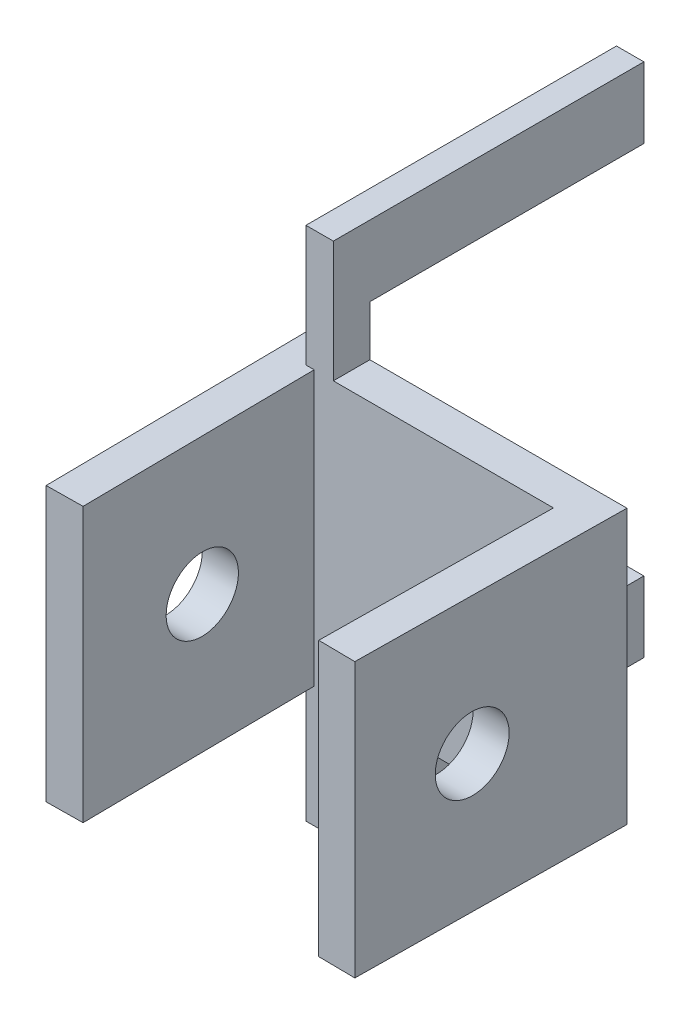
ISO-10303-21;
HEADER;
FILE_DESCRIPTION(('STEP AP214'),'2;1');
FILE_NAME('part.step','',(''),(''),'','','');
FILE_SCHEMA(('AUTOMOTIVE_DESIGN { 1 0 10303 214 1 1 1 1 }'));
ENDSEC;
DATA;
#1=APPLICATION_CONTEXT('core data for automotive mechanical design processes');
#2=APPLICATION_PROTOCOL_DEFINITION('international standard','automotive_design',2000,#1);
#3=PRODUCT_CONTEXT('',#1,'mechanical');
#4=PRODUCT('Part','Part','',(#3));
#5=PRODUCT_RELATED_PRODUCT_CATEGORY('part','',(#4));
#6=PRODUCT_DEFINITION_FORMATION('','',#4);
#7=PRODUCT_DEFINITION_CONTEXT('part definition',#1,'design');
#8=PRODUCT_DEFINITION('design','',#6,#7);
#9=PRODUCT_DEFINITION_SHAPE('','',#8);
#10=(LENGTH_UNIT() NAMED_UNIT(*) SI_UNIT(.MILLI.,.METRE.));
#11=(NAMED_UNIT(*) PLANE_ANGLE_UNIT() SI_UNIT($,.RADIAN.));
#12=(NAMED_UNIT(*) SI_UNIT($,.STERADIAN.) SOLID_ANGLE_UNIT());
#13=UNCERTAINTY_MEASURE_WITH_UNIT(LENGTH_MEASURE(1.E-05),#10,'distance_accuracy_value','');
#14=(GEOMETRIC_REPRESENTATION_CONTEXT(3) GLOBAL_UNCERTAINTY_ASSIGNED_CONTEXT((#13)) GLOBAL_UNIT_ASSIGNED_CONTEXT((#10,
#11,#12)) REPRESENTATION_CONTEXT('',''));
#15=CARTESIAN_POINT('',(0.,0.,0.));
#16=DIRECTION('',(0.,0.,1.));
#17=DIRECTION('',(1.,0.,0.));
#18=AXIS2_PLACEMENT_3D('',#15,#16,#17);
#19=CARTESIAN_POINT('',(0.,30.,0.));
#20=DIRECTION('',(0.,1.,0.));
#21=DIRECTION('',(0.,0.,1.));
#22=AXIS2_PLACEMENT_3D('',#19,#20,#21);
#23=PLANE('',#22);
#24=DIRECTION('',(0.,0.,-1.));
#25=VECTOR('',#24,1.);
#26=CARTESIAN_POINT('',(-10.9998132817287,30.,0.));
#27=LINE('',#26,#25);
#28=CARTESIAN_POINT('',(-10.9998132817287,30.,-12.8));
#29=VERTEX_POINT('',#28);
#30=CARTESIAN_POINT('',(-10.9998132817287,30.,-16.8));
#31=VERTEX_POINT('',#30);
#32=EDGE_CURVE('E252',#29,#31,#27,.T.);
#33=ORIENTED_EDGE('',*,*,#32,.F.);
#34=DIRECTION('',(1.,0.,0.));
#35=VECTOR('',#34,1.);
#36=CARTESIAN_POINT('',(-13.1,30.,-12.8));
#37=LINE('',#36,#35);
#38=CARTESIAN_POINT('',(13.1,30.,-12.8));
#39=VERTEX_POINT('',#38);
#40=EDGE_CURVE('E271',#29,#39,#37,.T.);
#41=ORIENTED_EDGE('',*,*,#40,.T.);
#42=DIRECTION('',(-0.0118101998876842,0.,0.999930257157274));
#43=VECTOR('',#42,1.);
#44=CARTESIAN_POINT('',(13.1,30.,-12.8));
#45=LINE('',#44,#43);
#46=CARTESIAN_POINT('',(12.8,30.,12.6));
#47=VERTEX_POINT('',#46);
#48=EDGE_CURVE('E273',#39,#47,#45,.T.);
#49=ORIENTED_EDGE('',*,*,#48,.T.);
#50=DIRECTION('',(0.999930257157274,0.,0.0118101998876842));
#51=VECTOR('',#50,1.);
#52=CARTESIAN_POINT('',(12.8,30.,12.6));
#53=LINE('',#52,#51);
#54=CARTESIAN_POINT('',(16.7997210286291,30.,12.6472407995507));
#55=VERTEX_POINT('',#54);
#56=EDGE_CURVE('E275',#47,#55,#53,.T.);
#57=ORIENTED_EDGE('',*,*,#56,.T.);
#58=DIRECTION('',(0.0118101998876842,0.,-0.999930257157274));
#59=VECTOR('',#58,1.);
#60=CARTESIAN_POINT('',(17.1475230853167,30.,-16.8));
#61=LINE('',#60,#59);
#62=CARTESIAN_POINT('',(17.1475230853167,30.,-16.8));
#63=VERTEX_POINT('',#62);
#64=EDGE_CURVE('E277',#55,#63,#61,.T.);
#65=ORIENTED_EDGE('',*,*,#64,.T.);
#66=DIRECTION('',(-1.,0.,0.));
#67=VECTOR('',#66,1.);
#68=CARTESIAN_POINT('',(-17.1471496487741,30.,-16.8));
#69=LINE('',#68,#67);
#70=EDGE_CURVE('E56',#63,#31,#69,.T.);
#71=ORIENTED_EDGE('',*,*,#70,.T.);
#72=EDGE_LOOP('',(#33,#41,#49,#57,#65,#71));
#73=FACE_BOUND('',#72,.T.);
#74=ADVANCED_FACE('F33',(#73),#23,.T.);
#75=CARTESIAN_POINT('',(0.,0.,0.));
#76=DIRECTION('',(0.,1.,0.));
#77=DIRECTION('',(0.,0.,1.));
#78=AXIS2_PLACEMENT_3D('',#75,#76,#77);
#79=PLANE('',#78);
#80=DIRECTION('',(1.,0.,0.));
#81=VECTOR('',#80,1.);
#82=CARTESIAN_POINT('',(-13.1,0.,-12.8));
#83=LINE('',#82,#81);
#84=CARTESIAN_POINT('',(-10.9998132817287,0.,-12.8));
#85=VERTEX_POINT('',#84);
#86=CARTESIAN_POINT('',(13.1,0.,-12.8));
#87=VERTEX_POINT('',#86);
#88=EDGE_CURVE('E289',#85,#87,#83,.T.);
#89=ORIENTED_EDGE('',*,*,#88,.F.);
#90=DIRECTION('',(0.,0.,-1.));
#91=VECTOR('',#90,1.);
#92=CARTESIAN_POINT('',(-10.9998132817287,0.,0.));
#93=LINE('',#92,#91);
#94=CARTESIAN_POINT('',(-10.9998132817287,0.,-16.8));
#95=VERTEX_POINT('',#94);
#96=EDGE_CURVE('E11',#85,#95,#93,.T.);
#97=ORIENTED_EDGE('',*,*,#96,.T.);
#98=DIRECTION('',(-1.,0.,0.));
#99=VECTOR('',#98,1.);
#100=CARTESIAN_POINT('',(-17.1471496487741,0.,-16.8));
#101=LINE('',#100,#99);
#102=CARTESIAN_POINT('',(17.1475230853167,0.,-16.8));
#103=VERTEX_POINT('',#102);
#104=EDGE_CURVE('E298',#103,#95,#101,.T.);
#105=ORIENTED_EDGE('',*,*,#104,.F.);
#106=DIRECTION('',(0.0118101998876842,0.,-0.999930257157274));
#107=VECTOR('',#106,1.);
#108=CARTESIAN_POINT('',(17.1475230853167,0.,-16.8));
#109=LINE('',#108,#107);
#110=CARTESIAN_POINT('',(16.7997210286291,0.,12.6472407995507));
#111=VERTEX_POINT('',#110);
#112=EDGE_CURVE('E295',#111,#103,#109,.T.);
#113=ORIENTED_EDGE('',*,*,#112,.F.);
#114=DIRECTION('',(0.999930257157274,0.,0.0118101998876842));
#115=VECTOR('',#114,1.);
#116=CARTESIAN_POINT('',(12.8,0.,12.6));
#117=LINE('',#116,#115);
#118=CARTESIAN_POINT('',(12.8,0.,12.6));
#119=VERTEX_POINT('',#118);
#120=EDGE_CURVE('E293',#119,#111,#117,.T.);
#121=ORIENTED_EDGE('',*,*,#120,.F.);
#122=DIRECTION('',(-0.0118101998876842,0.,0.999930257157274));
#123=VECTOR('',#122,1.);
#124=CARTESIAN_POINT('',(13.1,0.,-12.8));
#125=LINE('',#124,#123);
#126=EDGE_CURVE('E291',#87,#119,#125,.T.);
#127=ORIENTED_EDGE('',*,*,#126,.F.);
#128=EDGE_LOOP('',(#89,#97,#105,#113,#121,#127));
#129=FACE_BOUND('',#128,.T.);
#130=ADVANCED_FACE('F351',(#129),#79,.F.);
#131=CARTESIAN_POINT('',(-16.7997253700826,30.,12.8468717816807));
#132=DIRECTION('',(-0.0117179454201641,0.,-0.99993134252064));
#133=DIRECTION('',(-0.99993134252064,0.,0.0117179454201641));
#134=AXIS2_PLACEMENT_3D('',#131,#132,#133);
#135=PLANE('',#134);
#136=DIRECTION('',(0.999931342520641,0.,-0.0117179454201641));
#137=VECTOR('',#136,1.);
#138=CARTESIAN_POINT('',(-16.7997253700826,0.,12.8468717816807));
#139=LINE('',#138,#137);
#140=CARTESIAN_POINT('',(-16.7997253700826,0.,12.8468717816807));
#141=VERTEX_POINT('',#140);
#142=CARTESIAN_POINT('',(-12.8,0.,12.8));
#143=VERTEX_POINT('',#142);
#144=EDGE_CURVE('E264',#141,#143,#139,.T.);
#145=ORIENTED_EDGE('',*,*,#144,.T.);
#146=DIRECTION('',(0.,-1.,0.));
#147=VECTOR('',#146,1.);
#148=CARTESIAN_POINT('',(-12.8,30.,12.8));
#149=LINE('',#148,#147);
#150=CARTESIAN_POINT('',(-12.8,30.,12.8));
#151=VERTEX_POINT('',#150);
#152=EDGE_CURVE('E322',#151,#143,#149,.T.);
#153=ORIENTED_EDGE('',*,*,#152,.F.);
#154=DIRECTION('',(0.999931342520641,0.,-0.0117179454201641));
#155=VECTOR('',#154,1.);
#156=CARTESIAN_POINT('',(-16.7997253700826,30.,12.8468717816807));
#157=LINE('',#156,#155);
#158=CARTESIAN_POINT('',(-16.7997253700826,30.,12.8468717816807));
#159=VERTEX_POINT('',#158);
#160=EDGE_CURVE('E265',#159,#151,#157,.T.);
#161=ORIENTED_EDGE('',*,*,#160,.F.);
#162=DIRECTION('',(0.,-1.,0.));
#163=VECTOR('',#162,1.);
#164=CARTESIAN_POINT('',(-16.7997253700826,30.,12.8468717816807));
#165=LINE('',#164,#163);
#166=EDGE_CURVE('E283',#159,#141,#165,.T.);
#167=ORIENTED_EDGE('',*,*,#166,.T.);
#168=EDGE_LOOP('',(#145,#153,#161,#167));
#169=FACE_BOUND('',#168,.T.);
#170=ADVANCED_FACE('F35',(#169),#135,.F.);
#171=CARTESIAN_POINT('',(-12.8,30.,12.8));
#172=DIRECTION('',(-0.99993134252064,0.,0.0117179454201639));
#173=DIRECTION('',(0.0117179454201639,0.,0.99993134252064));
#174=AXIS2_PLACEMENT_3D('',#171,#172,#173);
#175=PLANE('',#174);
#176=CARTESIAN_POINT('',(-12.9547469811038,15.,-0.4050757208542));
#177=DIRECTION('',(-0.99993134252064,0.,0.0117179454201639));
#178=DIRECTION('',(0.0117179454201639,0.,0.99993134252064));
#179=AXIS2_PLACEMENT_3D('',#176,#177,#178);
#180=ELLIPSE('',#179,4.00110745377421,4.);
#181=CARTESIAN_POINT('',(-12.9078622223402,15.,3.59575702696759));
#182=VERTEX_POINT('',#181);
#183=EDGE_CURVE('E261',#182,#182,#180,.T.);
#184=ORIENTED_EDGE('',*,*,#183,.T.);
#185=EDGE_LOOP('',(#184));
#186=FACE_BOUND('',#185,.T.);
#187=DIRECTION('',(-0.0117179454201639,0.,-0.99993134252064));
#188=VECTOR('',#187,1.);
#189=CARTESIAN_POINT('',(-12.8,0.,12.8));
#190=LINE('',#189,#188);
#191=CARTESIAN_POINT('',(-13.1,0.,-12.8));
#192=VERTEX_POINT('',#191);
#193=EDGE_CURVE('E286',#143,#192,#190,.T.);
#194=ORIENTED_EDGE('',*,*,#193,.T.);
#195=DIRECTION('',(0.,-1.,0.));
#196=VECTOR('',#195,1.);
#197=CARTESIAN_POINT('',(-13.1,30.,-12.8));
#198=LINE('',#197,#196);
#199=CARTESIAN_POINT('',(-13.1,30.,-12.8));
#200=VERTEX_POINT('',#199);
#201=EDGE_CURVE('E319',#200,#192,#198,.T.);
#202=ORIENTED_EDGE('',*,*,#201,.F.);
#203=DIRECTION('',(-0.0117179454201639,0.,-0.99993134252064));
#204=VECTOR('',#203,1.);
#205=CARTESIAN_POINT('',(-12.8,30.,12.8));
#206=LINE('',#205,#204);
#207=EDGE_CURVE('E268',#151,#200,#206,.T.);
#208=ORIENTED_EDGE('',*,*,#207,.F.);
#209=ORIENTED_EDGE('',*,*,#152,.T.);
#210=EDGE_LOOP('',(#194,#202,#208,#209));
#211=FACE_BOUND('',#210,.T.);
#212=ADVANCED_FACE('F389',(#186,#211),#175,.F.);
#213=CARTESIAN_POINT('',(-13.1,30.,-12.8));
#214=DIRECTION('',(0.,0.,-1.));
#215=DIRECTION('',(-1.,0.,0.));
#216=AXIS2_PLACEMENT_3D('',#213,#214,#215);
#217=PLANE('',#216);
#218=ORIENTED_EDGE('',*,*,#40,.F.);
#219=DIRECTION('',(0.,-1.,0.));
#220=VECTOR('',#219,1.);
#221=CARTESIAN_POINT('',(-10.9998132817287,-5.5,-12.8));
#222=LINE('',#221,#220);
#223=CARTESIAN_POINT('',(-10.9998132817287,43.25,-12.8));
#224=VERTEX_POINT('',#223);
#225=EDGE_CURVE('E179',#224,#29,#222,.T.);
#226=ORIENTED_EDGE('',*,*,#225,.F.);
#227=DIRECTION('',(1.,0.,0.));
#228=VECTOR('',#227,1.);
#229=CARTESIAN_POINT('',(-10.9998132817287,43.25,-12.8));
#230=LINE('',#229,#228);
#231=CARTESIAN_POINT('',(-13.9998132817287,43.25,-12.8));
#232=VERTEX_POINT('',#231);
#233=EDGE_CURVE('E189',#232,#224,#230,.T.);
#234=ORIENTED_EDGE('',*,*,#233,.F.);
#235=DIRECTION('',(0.,1.,0.));
#236=VECTOR('',#235,1.);
#237=CARTESIAN_POINT('',(-13.9998132817287,35.5,-12.8));
#238=LINE('',#237,#236);
#239=CARTESIAN_POINT('',(-13.9998132817287,30.,-12.8));
#240=VERTEX_POINT('',#239);
#241=EDGE_CURVE('E234',#240,#232,#238,.T.);
#242=ORIENTED_EDGE('',*,*,#241,.F.);
#243=DIRECTION('',(1.,0.,0.));
#244=VECTOR('',#243,1.);
#245=CARTESIAN_POINT('',(0.,30.,-12.8));
#246=LINE('',#245,#244);
#247=EDGE_CURVE('E48',#240,#200,#246,.T.);
#248=ORIENTED_EDGE('',*,*,#247,.T.);
#249=ORIENTED_EDGE('',*,*,#201,.T.);
#250=DIRECTION('',(1.,0.,0.));
#251=VECTOR('',#250,1.);
#252=CARTESIAN_POINT('',(0.,0.,-12.8));
#253=LINE('',#252,#251);
#254=CARTESIAN_POINT('',(-13.9998132817287,0.,-12.8));
#255=VERTEX_POINT('',#254);
#256=EDGE_CURVE('E325',#255,#192,#253,.T.);
#257=ORIENTED_EDGE('',*,*,#256,.F.);
#258=CARTESIAN_POINT('',(-13.9998132817287,-13.25,-12.8));
#259=VERTEX_POINT('',#258);
#260=EDGE_CURVE('E180',#259,#255,#238,.T.);
#261=ORIENTED_EDGE('',*,*,#260,.F.);
#262=DIRECTION('',(-1.,0.,0.));
#263=VECTOR('',#262,1.);
#264=CARTESIAN_POINT('',(-10.9998132817287,-13.25,-12.8));
#265=LINE('',#264,#263);
#266=CARTESIAN_POINT('',(-10.9998132817287,-13.25,-12.8));
#267=VERTEX_POINT('',#266);
#268=EDGE_CURVE('E186',#267,#259,#265,.T.);
#269=ORIENTED_EDGE('',*,*,#268,.F.);
#270=EDGE_CURVE('E171',#85,#267,#222,.T.);
#271=ORIENTED_EDGE('',*,*,#270,.F.);
#272=ORIENTED_EDGE('',*,*,#88,.T.);
#273=DIRECTION('',(0.,-1.,0.));
#274=VECTOR('',#273,1.);
#275=CARTESIAN_POINT('',(13.1,30.,-12.8));
#276=LINE('',#275,#274);
#277=EDGE_CURVE('E316',#39,#87,#276,.T.);
#278=ORIENTED_EDGE('',*,*,#277,.F.);
#279=EDGE_LOOP('',(#218,#226,#234,#242,#248,#249,#257,#261,#269,#271,#272,#278));
#280=FACE_BOUND('',#279,.T.);
#281=ADVANCED_FACE('F193',(#280),#217,.F.);
#282=CARTESIAN_POINT('',(13.1,30.,-12.8));
#283=DIRECTION('',(0.999930257157274,0.,0.0118101998876842));
#284=DIRECTION('',(0.0118101998876842,0.,-0.999930257157275));
#285=AXIS2_PLACEMENT_3D('',#282,#283,#284);
#286=PLANE('',#285);
#287=CARTESIAN_POINT('',(12.9499895385736,15.,-0.0991142658973837));
#288=DIRECTION('',(0.999930257157274,0.,0.0118101998876842));
#289=DIRECTION('',(0.0118101998876842,0.,-0.999930257157275));
#290=AXIS2_PLACEMENT_3D('',#287,#288,#289);
#291=CIRCLE('',#290,4.);
#292=CARTESIAN_POINT('',(12.9972303381243,15.,-4.09883529452648));
#293=VERTEX_POINT('',#292);
#294=EDGE_CURVE('E258',#293,#293,#291,.T.);
#295=ORIENTED_EDGE('',*,*,#294,.T.);
#296=EDGE_LOOP('',(#295));
#297=FACE_BOUND('',#296,.T.);
#298=ORIENTED_EDGE('',*,*,#126,.T.);
#299=DIRECTION('',(0.,-1.,0.));
#300=VECTOR('',#299,1.);
#301=CARTESIAN_POINT('',(12.8,30.,12.6));
#302=LINE('',#301,#300);
#303=EDGE_CURVE('E313',#47,#119,#302,.T.);
#304=ORIENTED_EDGE('',*,*,#303,.F.);
#305=ORIENTED_EDGE('',*,*,#48,.F.);
#306=ORIENTED_EDGE('',*,*,#277,.T.);
#307=EDGE_LOOP('',(#298,#304,#305,#306));
#308=FACE_BOUND('',#307,.T.);
#309=ADVANCED_FACE('F357',(#297,#308),#286,.F.);
#310=CARTESIAN_POINT('',(12.8,30.,12.6));
#311=DIRECTION('',(0.0118101998876842,0.,-0.999930257157274));
#312=DIRECTION('',(-0.999930257157275,0.,-0.0118101998876842));
#313=AXIS2_PLACEMENT_3D('',#310,#311,#312);
#314=PLANE('',#313);
#315=ORIENTED_EDGE('',*,*,#120,.T.);
#316=DIRECTION('',(0.,-1.,0.));
#317=VECTOR('',#316,1.);
#318=CARTESIAN_POINT('',(16.7997210286291,30.,12.6472407995507));
#319=LINE('',#318,#317);
#320=EDGE_CURVE('E310',#55,#111,#319,.T.);
#321=ORIENTED_EDGE('',*,*,#320,.F.);
#322=ORIENTED_EDGE('',*,*,#56,.F.);
#323=ORIENTED_EDGE('',*,*,#303,.T.);
#324=EDGE_LOOP('',(#315,#321,#322,#323));
#325=FACE_BOUND('',#324,.T.);
#326=ADVANCED_FACE('F420',(#325),#314,.F.);
#327=CARTESIAN_POINT('',(17.1475230853167,30.,-16.8));
#328=DIRECTION('',(-0.999930257157274,0.,-0.0118101998876842));
#329=DIRECTION('',(-0.0118101998876842,0.,0.999930257157275));
#330=AXIS2_PLACEMENT_3D('',#327,#328,#329);
#331=PLANE('',#330);
#332=CARTESIAN_POINT('',(16.9497105672027,15.,-0.0518734663466469));
#333=DIRECTION('',(0.999930257157274,0.,0.0118101998876842));
#334=DIRECTION('',(0.0118101998876842,0.,-0.999930257157274));
#335=AXIS2_PLACEMENT_3D('',#332,#333,#334);
#336=CIRCLE('',#335,4.);
#337=CARTESIAN_POINT('',(16.9969513667534,15.,-4.05159449497575));
#338=VERTEX_POINT('',#337);
#339=EDGE_CURVE('E254',#338,#338,#336,.T.);
#340=ORIENTED_EDGE('',*,*,#339,.F.);
#341=EDGE_LOOP('',(#340));
#342=FACE_BOUND('',#341,.T.);
#343=ORIENTED_EDGE('',*,*,#112,.T.);
#344=DIRECTION('',(0.,-1.,0.));
#345=VECTOR('',#344,1.);
#346=CARTESIAN_POINT('',(17.1475230853167,30.,-16.8));
#347=LINE('',#346,#345);
#348=EDGE_CURVE('E307',#63,#103,#347,.T.);
#349=ORIENTED_EDGE('',*,*,#348,.F.);
#350=ORIENTED_EDGE('',*,*,#64,.F.);
#351=ORIENTED_EDGE('',*,*,#320,.T.);
#352=EDGE_LOOP('',(#343,#349,#350,#351));
#353=FACE_BOUND('',#352,.T.);
#354=ADVANCED_FACE('F415',(#342,#353),#331,.F.);
#355=CARTESIAN_POINT('',(-17.1471496487741,30.,-16.8));
#356=DIRECTION('',(0.,0.,1.));
#357=DIRECTION('',(1.,0.,0.));
#358=AXIS2_PLACEMENT_3D('',#355,#356,#357);
#359=PLANE('',#358);
#360=CARTESIAN_POINT('',(-13.9998132817287,30.,-16.8));
#361=VERTEX_POINT('',#360);
#362=CARTESIAN_POINT('',(-17.1471496487741,30.,-16.8));
#363=VERTEX_POINT('',#362);
#364=EDGE_CURVE('E279',#361,#363,#69,.T.);
#365=ORIENTED_EDGE('',*,*,#364,.F.);
#366=DIRECTION('',(0.,1.,0.));
#367=VECTOR('',#366,1.);
#368=CARTESIAN_POINT('',(-13.9998132817287,35.5,-16.8));
#369=LINE('',#368,#367);
#370=CARTESIAN_POINT('',(-13.9998132817287,35.5,-16.8));
#371=VERTEX_POINT('',#370);
#372=EDGE_CURVE('E239',#361,#371,#369,.T.);
#373=ORIENTED_EDGE('',*,*,#372,.T.);
#374=DIRECTION('',(1.,0.,0.));
#375=VECTOR('',#374,1.);
#376=CARTESIAN_POINT('',(-10.9998132817287,35.5,-16.8));
#377=LINE('',#376,#375);
#378=CARTESIAN_POINT('',(-10.9998132817287,35.5,-16.8));
#379=VERTEX_POINT('',#378);
#380=EDGE_CURVE('E242',#371,#379,#377,.T.);
#381=ORIENTED_EDGE('',*,*,#380,.T.);
#382=DIRECTION('',(0.,-1.,0.));
#383=VECTOR('',#382,1.);
#384=CARTESIAN_POINT('',(-10.9998132817287,-5.5,-16.8));
#385=LINE('',#384,#383);
#386=EDGE_CURVE('E246',#379,#31,#385,.T.);
#387=ORIENTED_EDGE('',*,*,#386,.T.);
#388=ORIENTED_EDGE('',*,*,#70,.F.);
#389=ORIENTED_EDGE('',*,*,#348,.T.);
#390=ORIENTED_EDGE('',*,*,#104,.T.);
#391=CARTESIAN_POINT('',(-10.9998132817287,-5.50000000000001,-16.8));
#392=VERTEX_POINT('',#391);
#393=EDGE_CURVE('E245',#95,#392,#385,.T.);
#394=ORIENTED_EDGE('',*,*,#393,.T.);
#395=DIRECTION('',(-1.,0.,0.));
#396=VECTOR('',#395,1.);
#397=CARTESIAN_POINT('',(-10.9998132817287,-5.5,-16.8));
#398=LINE('',#397,#396);
#399=CARTESIAN_POINT('',(-13.9998132817287,-5.5,-16.8));
#400=VERTEX_POINT('',#399);
#401=EDGE_CURVE('E233',#392,#400,#398,.T.);
#402=ORIENTED_EDGE('',*,*,#401,.T.);
#403=CARTESIAN_POINT('',(-13.9998132817287,0.,-16.8));
#404=VERTEX_POINT('',#403);
#405=EDGE_CURVE('E240',#400,#404,#369,.T.);
#406=ORIENTED_EDGE('',*,*,#405,.T.);
#407=CARTESIAN_POINT('',(-17.1471496487741,0.,-16.8));
#408=VERTEX_POINT('',#407);
#409=EDGE_CURVE('E297',#404,#408,#101,.T.);
#410=ORIENTED_EDGE('',*,*,#409,.T.);
#411=DIRECTION('',(0.,-1.,0.));
#412=VECTOR('',#411,1.);
#413=CARTESIAN_POINT('',(-17.1471496487741,30.,-16.8));
#414=LINE('',#413,#412);
#415=EDGE_CURVE('E304',#363,#408,#414,.T.);
#416=ORIENTED_EDGE('',*,*,#415,.F.);
#417=EDGE_LOOP('',(#365,#373,#381,#387,#388,#389,#390,#394,#402,#406,#410,#416));
#418=FACE_BOUND('',#417,.T.);
#419=ADVANCED_FACE('F346',(#418),#359,.F.);
#420=CARTESIAN_POINT('',(-16.7997253700826,30.,12.8468717816807));
#421=DIRECTION('',(0.99993134252064,0.,-0.0117179454201639));
#422=DIRECTION('',(-0.0117179454201639,0.,-0.99993134252064));
#423=AXIS2_PLACEMENT_3D('',#420,#421,#422);
#424=PLANE('',#423);
#425=CARTESIAN_POINT('',(-16.9555753862701,15.,-0.452329599655377));
#426=DIRECTION('',(0.99993134252064,0.,-0.0117179454201639));
#427=DIRECTION('',(0.0117179454201639,0.,0.99993134252064));
#428=AXIS2_PLACEMENT_3D('',#425,#426,#427);
#429=ELLIPSE('',#428,4.00110745377421,4.);
#430=CARTESIAN_POINT('',(-16.9086906275066,15.,3.54850314816641));
#431=VERTEX_POINT('',#430);
#432=EDGE_CURVE('E257',#431,#431,#429,.T.);
#433=ORIENTED_EDGE('',*,*,#432,.T.);
#434=EDGE_LOOP('',(#433));
#435=FACE_BOUND('',#434,.T.);
#436=DIRECTION('',(0.0117179454201639,0.,0.99993134252064));
#437=VECTOR('',#436,1.);
#438=CARTESIAN_POINT('',(-16.7997253700826,0.,12.8468717816807));
#439=LINE('',#438,#437);
#440=EDGE_CURVE('E269',#408,#141,#439,.T.);
#441=ORIENTED_EDGE('',*,*,#440,.T.);
#442=ORIENTED_EDGE('',*,*,#166,.F.);
#443=DIRECTION('',(0.0117179454201639,0.,0.99993134252064));
#444=VECTOR('',#443,1.);
#445=CARTESIAN_POINT('',(-16.7997253700826,30.,12.8468717816807));
#446=LINE('',#445,#444);
#447=EDGE_CURVE('E281',#363,#159,#446,.T.);
#448=ORIENTED_EDGE('',*,*,#447,.F.);
#449=ORIENTED_EDGE('',*,*,#415,.T.);
#450=EDGE_LOOP('',(#441,#442,#448,#449));
#451=FACE_BOUND('',#450,.T.);
#452=ADVANCED_FACE('F382',(#435,#451),#424,.F.);
#453=DIRECTION('',(0.,0.,1.));
#454=VECTOR('',#453,1.);
#455=CARTESIAN_POINT('',(-13.9998132817287,30.,0.));
#456=LINE('',#455,#454);
#457=EDGE_CURVE('E250',#361,#240,#456,.T.);
#458=ORIENTED_EDGE('',*,*,#457,.F.);
#459=ORIENTED_EDGE('',*,*,#364,.T.);
#460=ORIENTED_EDGE('',*,*,#447,.T.);
#461=ORIENTED_EDGE('',*,*,#160,.T.);
#462=ORIENTED_EDGE('',*,*,#207,.T.);
#463=ORIENTED_EDGE('',*,*,#247,.F.);
#464=EDGE_LOOP('',(#458,#459,#460,#461,#462,#463));
#465=FACE_BOUND('',#464,.T.);
#466=ADVANCED_FACE('F377',(#465),#23,.T.);
#467=ORIENTED_EDGE('',*,*,#409,.F.);
#468=DIRECTION('',(0.,0.,1.));
#469=VECTOR('',#468,1.);
#470=CARTESIAN_POINT('',(-13.9998132817287,0.,0.));
#471=LINE('',#470,#469);
#472=EDGE_CURVE('E41',#404,#255,#471,.T.);
#473=ORIENTED_EDGE('',*,*,#472,.T.);
#474=ORIENTED_EDGE('',*,*,#256,.T.);
#475=ORIENTED_EDGE('',*,*,#193,.F.);
#476=ORIENTED_EDGE('',*,*,#144,.F.);
#477=ORIENTED_EDGE('',*,*,#440,.F.);
#478=EDGE_LOOP('',(#467,#473,#474,#475,#476,#477));
#479=FACE_BOUND('',#478,.T.);
#480=ADVANCED_FACE('F332',(#479),#79,.F.);
#481=CARTESIAN_POINT('',(-23.0474997190883,15.,-0.524281461854016));
#482=DIRECTION('',(0.999930257157274,0.,0.0118101998876842));
#483=DIRECTION('',(0.0118101998876842,0.,-0.999930257157275));
#484=AXIS2_PLACEMENT_3D('',#481,#482,#483);
#485=CYLINDRICAL_SURFACE('',#484,4.);
#486=ORIENTED_EDGE('',*,*,#432,.F.);
#487=EDGE_LOOP('',(#486));
#488=FACE_BOUND('',#487,.T.);
#489=ORIENTED_EDGE('',*,*,#183,.F.);
#490=EDGE_LOOP('',(#489));
#491=FACE_BOUND('',#490,.T.);
#492=ADVANCED_FACE('F409',(#488,#491),#485,.F.);
#493=ORIENTED_EDGE('',*,*,#339,.T.);
#494=EDGE_LOOP('',(#493));
#495=FACE_BOUND('',#494,.T.);
#496=ORIENTED_EDGE('',*,*,#294,.F.);
#497=EDGE_LOOP('',(#496));
#498=FACE_BOUND('',#497,.T.);
#499=ADVANCED_FACE('F431',(#495,#498),#485,.F.);
#500=CARTESIAN_POINT('',(-13.9998132817287,35.5,-12.8));
#501=DIRECTION('',(-1.,0.,0.));
#502=DIRECTION('',(0.,0.,1.));
#503=AXIS2_PLACEMENT_3D('',#500,#501,#502);
#504=PLANE('',#503);
#505=ORIENTED_EDGE('',*,*,#472,.F.);
#506=ORIENTED_EDGE('',*,*,#405,.F.);
#507=DIRECTION('',(0.,0.,1.));
#508=VECTOR('',#507,1.);
#509=CARTESIAN_POINT('',(-13.9998132817287,-5.50000000000001,-46.8));
#510=LINE('',#509,#508);
#511=CARTESIAN_POINT('',(-13.9998132817287,-5.50000000000001,-46.8));
#512=VERTEX_POINT('',#511);
#513=EDGE_CURVE('E208',#512,#400,#510,.T.);
#514=ORIENTED_EDGE('',*,*,#513,.F.);
#515=DIRECTION('',(0.,1.,0.));
#516=VECTOR('',#515,1.);
#517=CARTESIAN_POINT('',(-13.9998132817287,-5.50000000000001,-46.8));
#518=LINE('',#517,#516);
#519=CARTESIAN_POINT('',(-13.9998132817287,-13.25,-46.8));
#520=VERTEX_POINT('',#519);
#521=EDGE_CURVE('E201',#520,#512,#518,.T.);
#522=ORIENTED_EDGE('',*,*,#521,.F.);
#523=DIRECTION('',(0.,0.,1.));
#524=VECTOR('',#523,1.);
#525=CARTESIAN_POINT('',(-13.9998132817287,-13.25,-46.8));
#526=LINE('',#525,#524);
#527=EDGE_CURVE('E190',#520,#259,#526,.T.);
#528=ORIENTED_EDGE('',*,*,#527,.T.);
#529=ORIENTED_EDGE('',*,*,#260,.T.);
#530=EDGE_LOOP('',(#505,#506,#514,#522,#528,#529));
#531=FACE_BOUND('',#530,.T.);
#532=ADVANCED_FACE('F336',(#531),#504,.T.);
#533=CARTESIAN_POINT('',(-10.9998132817287,-5.5,-12.8));
#534=DIRECTION('',(1.,0.,0.));
#535=DIRECTION('',(0.,1.,0.));
#536=AXIS2_PLACEMENT_3D('',#533,#534,#535);
#537=PLANE('',#536);
#538=ORIENTED_EDGE('',*,*,#96,.F.);
#539=ORIENTED_EDGE('',*,*,#270,.T.);
#540=DIRECTION('',(0.,0.,1.));
#541=VECTOR('',#540,1.);
#542=CARTESIAN_POINT('',(-10.9998132817287,-13.25,-46.8));
#543=LINE('',#542,#541);
#544=CARTESIAN_POINT('',(-10.9998132817287,-13.25,-46.8));
#545=VERTEX_POINT('',#544);
#546=EDGE_CURVE('E175',#545,#267,#543,.T.);
#547=ORIENTED_EDGE('',*,*,#546,.F.);
#548=DIRECTION('',(0.,-1.,0.));
#549=VECTOR('',#548,1.);
#550=CARTESIAN_POINT('',(-10.9998132817287,-5.50000000000001,-46.8));
#551=LINE('',#550,#549);
#552=CARTESIAN_POINT('',(-10.9998132817287,-5.50000000000001,-46.8));
#553=VERTEX_POINT('',#552);
#554=EDGE_CURVE('E196',#553,#545,#551,.T.);
#555=ORIENTED_EDGE('',*,*,#554,.F.);
#556=DIRECTION('',(0.,0.,1.));
#557=VECTOR('',#556,1.);
#558=CARTESIAN_POINT('',(-10.9998132817287,-5.50000000000001,-46.8));
#559=LINE('',#558,#557);
#560=EDGE_CURVE('E205',#553,#392,#559,.T.);
#561=ORIENTED_EDGE('',*,*,#560,.T.);
#562=ORIENTED_EDGE('',*,*,#393,.F.);
#563=EDGE_LOOP('',(#538,#539,#547,#555,#561,#562));
#564=FACE_BOUND('',#563,.T.);
#565=ADVANCED_FACE('F173',(#564),#537,.T.);
#566=ORIENTED_EDGE('',*,*,#225,.T.);
#567=ORIENTED_EDGE('',*,*,#32,.T.);
#568=ORIENTED_EDGE('',*,*,#386,.F.);
#569=DIRECTION('',(0.,0.,1.));
#570=VECTOR('',#569,1.);
#571=CARTESIAN_POINT('',(-10.9998132817287,35.5,-46.8));
#572=LINE('',#571,#570);
#573=CARTESIAN_POINT('',(-10.9998132817287,35.5,-46.8));
#574=VERTEX_POINT('',#573);
#575=EDGE_CURVE('E222',#574,#379,#572,.T.);
#576=ORIENTED_EDGE('',*,*,#575,.F.);
#577=DIRECTION('',(0.,-1.,0.));
#578=VECTOR('',#577,1.);
#579=CARTESIAN_POINT('',(-10.9998132817287,35.5,-46.8));
#580=LINE('',#579,#578);
#581=CARTESIAN_POINT('',(-10.9998132817287,43.25,-46.8));
#582=VERTEX_POINT('',#581);
#583=EDGE_CURVE('E220',#582,#574,#580,.T.);
#584=ORIENTED_EDGE('',*,*,#583,.F.);
#585=DIRECTION('',(0.,0.,1.));
#586=VECTOR('',#585,1.);
#587=CARTESIAN_POINT('',(-10.9998132817287,43.25,-46.8));
#588=LINE('',#587,#586);
#589=EDGE_CURVE('E224',#582,#224,#588,.T.);
#590=ORIENTED_EDGE('',*,*,#589,.T.);
#591=EDGE_LOOP('',(#566,#567,#568,#576,#584,#590));
#592=FACE_BOUND('',#591,.T.);
#593=ADVANCED_FACE('F363',(#592),#537,.T.);
#594=ORIENTED_EDGE('',*,*,#372,.F.);
#595=ORIENTED_EDGE('',*,*,#457,.T.);
#596=ORIENTED_EDGE('',*,*,#241,.T.);
#597=DIRECTION('',(0.,0.,1.));
#598=VECTOR('',#597,1.);
#599=CARTESIAN_POINT('',(-13.9998132817287,43.25,-46.8));
#600=LINE('',#599,#598);
#601=CARTESIAN_POINT('',(-13.9998132817287,43.25,-46.8));
#602=VERTEX_POINT('',#601);
#603=EDGE_CURVE('E227',#602,#232,#600,.T.);
#604=ORIENTED_EDGE('',*,*,#603,.F.);
#605=DIRECTION('',(0.,1.,0.));
#606=VECTOR('',#605,1.);
#607=CARTESIAN_POINT('',(-13.9998132817287,35.5,-46.8));
#608=LINE('',#607,#606);
#609=CARTESIAN_POINT('',(-13.9998132817287,35.5,-46.8));
#610=VERTEX_POINT('',#609);
#611=EDGE_CURVE('E216',#610,#602,#608,.T.);
#612=ORIENTED_EDGE('',*,*,#611,.F.);
#613=DIRECTION('',(0.,0.,1.));
#614=VECTOR('',#613,1.);
#615=CARTESIAN_POINT('',(-13.9998132817287,35.5,-46.8));
#616=LINE('',#615,#614);
#617=EDGE_CURVE('E230',#610,#371,#616,.T.);
#618=ORIENTED_EDGE('',*,*,#617,.T.);
#619=EDGE_LOOP('',(#594,#595,#596,#604,#612,#618));
#620=FACE_BOUND('',#619,.T.);
#621=ADVANCED_FACE('F375',(#620),#504,.T.);
#622=CARTESIAN_POINT('',(-10.9998132817287,35.5,-46.8));
#623=DIRECTION('',(0.,1.,0.));
#624=DIRECTION('',(0.,0.,1.));
#625=AXIS2_PLACEMENT_3D('',#622,#623,#624);
#626=PLANE('',#625);
#627=ORIENTED_EDGE('',*,*,#380,.F.);
#628=ORIENTED_EDGE('',*,*,#617,.F.);
#629=DIRECTION('',(-1.,0.,0.));
#630=VECTOR('',#629,1.);
#631=CARTESIAN_POINT('',(-10.9998132817287,35.5,-46.8));
#632=LINE('',#631,#630);
#633=EDGE_CURVE('E213',#574,#610,#632,.T.);
#634=ORIENTED_EDGE('',*,*,#633,.F.);
#635=ORIENTED_EDGE('',*,*,#575,.T.);
#636=EDGE_LOOP('',(#627,#628,#634,#635));
#637=FACE_BOUND('',#636,.T.);
#638=ADVANCED_FACE('F442',(#637),#626,.F.);
#639=CARTESIAN_POINT('',(-10.9998132817287,43.25,-46.8));
#640=DIRECTION('',(0.,-1.,0.));
#641=DIRECTION('',(0.,0.,-1.));
#642=AXIS2_PLACEMENT_3D('',#639,#640,#641);
#643=PLANE('',#642);
#644=ORIENTED_EDGE('',*,*,#603,.T.);
#645=ORIENTED_EDGE('',*,*,#233,.T.);
#646=ORIENTED_EDGE('',*,*,#589,.F.);
#647=DIRECTION('',(1.,0.,0.));
#648=VECTOR('',#647,1.);
#649=CARTESIAN_POINT('',(-10.9998132817287,43.25,-46.8));
#650=LINE('',#649,#648);
#651=EDGE_CURVE('E218',#602,#582,#650,.T.);
#652=ORIENTED_EDGE('',*,*,#651,.F.);
#653=EDGE_LOOP('',(#644,#645,#646,#652));
#654=FACE_BOUND('',#653,.T.);
#655=ADVANCED_FACE('F370',(#654),#643,.F.);
#656=CARTESIAN_POINT('',(0.,0.,-46.8));
#657=DIRECTION('',(0.,0.,-1.));
#658=DIRECTION('',(-1.,0.,0.));
#659=AXIS2_PLACEMENT_3D('',#656,#657,#658);
#660=PLANE('',#659);
#661=ORIENTED_EDGE('',*,*,#633,.T.);
#662=ORIENTED_EDGE('',*,*,#611,.T.);
#663=ORIENTED_EDGE('',*,*,#651,.T.);
#664=ORIENTED_EDGE('',*,*,#583,.T.);
#665=EDGE_LOOP('',(#661,#662,#663,#664));
#666=FACE_BOUND('',#665,.T.);
#667=ADVANCED_FACE('F450',(#666),#660,.T.);
#668=CARTESIAN_POINT('',(-10.9998132817287,-13.25,-46.8));
#669=DIRECTION('',(0.,1.,0.));
#670=DIRECTION('',(0.,0.,1.));
#671=AXIS2_PLACEMENT_3D('',#668,#669,#670);
#672=PLANE('',#671);
#673=ORIENTED_EDGE('',*,*,#546,.T.);
#674=ORIENTED_EDGE('',*,*,#268,.T.);
#675=ORIENTED_EDGE('',*,*,#527,.F.);
#676=DIRECTION('',(-1.,0.,0.));
#677=VECTOR('',#676,1.);
#678=CARTESIAN_POINT('',(-10.9998132817287,-13.25,-46.8));
#679=LINE('',#678,#677);
#680=EDGE_CURVE('E187',#545,#520,#679,.T.);
#681=ORIENTED_EDGE('',*,*,#680,.F.);
#682=EDGE_LOOP('',(#673,#674,#675,#681));
#683=FACE_BOUND('',#682,.T.);
#684=ADVANCED_FACE('F184',(#683),#672,.F.);
#685=CARTESIAN_POINT('',(-10.9998132817287,-5.50000000000001,-46.8));
#686=DIRECTION('',(0.,-1.,0.));
#687=DIRECTION('',(0.,0.,-1.));
#688=AXIS2_PLACEMENT_3D('',#685,#686,#687);
#689=PLANE('',#688);
#690=ORIENTED_EDGE('',*,*,#401,.F.);
#691=ORIENTED_EDGE('',*,*,#560,.F.);
#692=DIRECTION('',(1.,0.,0.));
#693=VECTOR('',#692,1.);
#694=CARTESIAN_POINT('',(-10.9998132817287,-5.50000000000001,-46.8));
#695=LINE('',#694,#693);
#696=EDGE_CURVE('E203',#512,#553,#695,.T.);
#697=ORIENTED_EDGE('',*,*,#696,.F.);
#698=ORIENTED_EDGE('',*,*,#513,.T.);
#699=EDGE_LOOP('',(#690,#691,#697,#698));
#700=FACE_BOUND('',#699,.T.);
#701=ADVANCED_FACE('F456',(#700),#689,.F.);
#702=CARTESIAN_POINT('',(0.,0.,-46.8));
#703=DIRECTION('',(0.,0.,-1.));
#704=DIRECTION('',(-1.,0.,0.));
#705=AXIS2_PLACEMENT_3D('',#702,#703,#704);
#706=PLANE('',#705);
#707=ORIENTED_EDGE('',*,*,#554,.T.);
#708=ORIENTED_EDGE('',*,*,#680,.T.);
#709=ORIENTED_EDGE('',*,*,#521,.T.);
#710=ORIENTED_EDGE('',*,*,#696,.T.);
#711=EDGE_LOOP('',(#707,#708,#709,#710));
#712=FACE_BOUND('',#711,.T.);
#713=ADVANCED_FACE('F341',(#712),#706,.T.);
#714=CLOSED_SHELL('',(#74,#130,#170,#212,#281,#309,#326,#354,#419,#452,#466,#480,#492,#499,#532,
#565,#593,#621,#638,#655,#667,#684,#701,#713));
#715=MANIFOLD_SOLID_BREP('B2',#714);
#716=ADVANCED_BREP_SHAPE_REPRESENTATION('',(#18,#715),#14);
#717=SHAPE_DEFINITION_REPRESENTATION(#9,#716);
ENDSEC;
END-ISO-10303-21;
